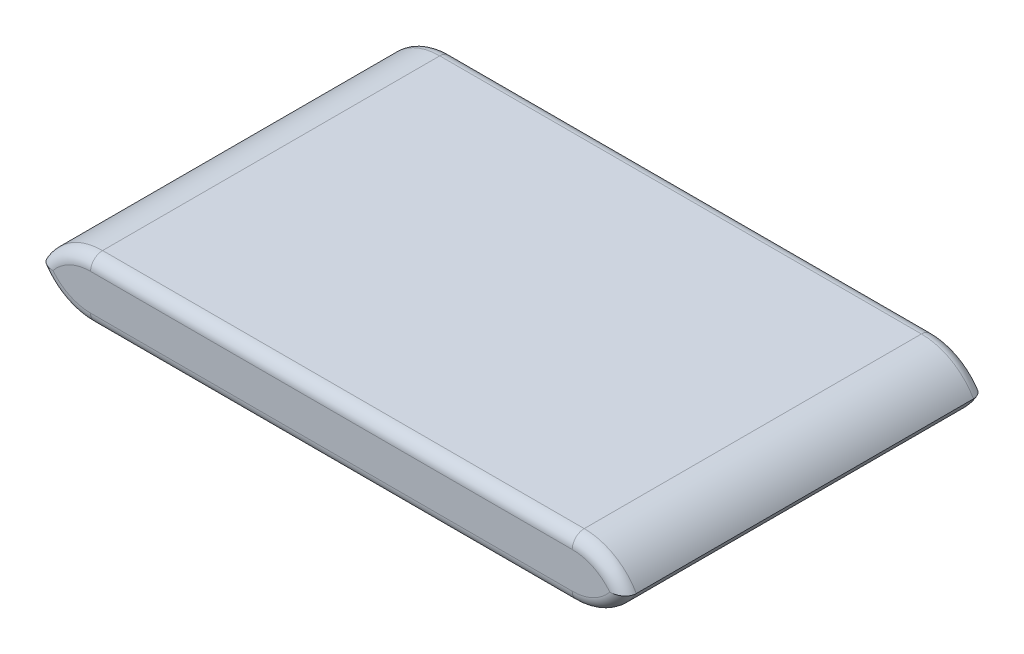
ISO-10303-21;
HEADER;
FILE_DESCRIPTION(('STEP AP214'),'2;1');
FILE_NAME('part.step','',(''),(''),'','','');
FILE_SCHEMA(('AUTOMOTIVE_DESIGN { 1 0 10303 214 1 1 1 1 }'));
ENDSEC;
DATA;
#1=APPLICATION_CONTEXT('core data for automotive mechanical design processes');
#2=APPLICATION_PROTOCOL_DEFINITION('international standard','automotive_design',2000,#1);
#3=PRODUCT_CONTEXT('',#1,'mechanical');
#4=PRODUCT('Part','Part','',(#3));
#5=PRODUCT_RELATED_PRODUCT_CATEGORY('part','',(#4));
#6=PRODUCT_DEFINITION_FORMATION('','',#4);
#7=PRODUCT_DEFINITION_CONTEXT('part definition',#1,'design');
#8=PRODUCT_DEFINITION('design','',#6,#7);
#9=PRODUCT_DEFINITION_SHAPE('','',#8);
#10=(LENGTH_UNIT() NAMED_UNIT(*) SI_UNIT(.MILLI.,.METRE.));
#11=(NAMED_UNIT(*) PLANE_ANGLE_UNIT() SI_UNIT($,.RADIAN.));
#12=(NAMED_UNIT(*) SI_UNIT($,.STERADIAN.) SOLID_ANGLE_UNIT());
#13=UNCERTAINTY_MEASURE_WITH_UNIT(LENGTH_MEASURE(1.E-05),#10,'distance_accuracy_value','');
#14=(GEOMETRIC_REPRESENTATION_CONTEXT(3) GLOBAL_UNCERTAINTY_ASSIGNED_CONTEXT((#13)) GLOBAL_UNIT_ASSIGNED_CONTEXT((#10,
#11,#12)) REPRESENTATION_CONTEXT('',''));
#15=CARTESIAN_POINT('',(0.,0.,0.));
#16=DIRECTION('',(0.,0.,1.));
#17=DIRECTION('',(1.,0.,0.));
#18=AXIS2_PLACEMENT_3D('',#15,#16,#17);
#19=CARTESIAN_POINT('',(-25.,5.,-15.));
#20=DIRECTION('',(0.,0.,1.));
#21=DIRECTION('',(1.,0.,0.));
#22=AXIS2_PLACEMENT_3D('',#19,#20,#21);
#23=PLANE('',#22);
#24=CARTESIAN_POINT('',(20.,0.,-15.));
#25=DIRECTION('',(0.,0.,1.));
#26=DIRECTION('',(1.,0.,0.));
#27=AXIS2_PLACEMENT_3D('',#24,#25,#26);
#28=CIRCLE('',#27,4.);
#29=CARTESIAN_POINT('',(20.,4.,-15.));
#30=VERTEX_POINT('',#29);
#31=CARTESIAN_POINT('',(23.1224989991992,2.5,-15.));
#32=VERTEX_POINT('',#31);
#33=EDGE_CURVE('E149',#30,#32,#28,.F.);
#34=ORIENTED_EDGE('',*,*,#33,.T.);
#35=CARTESIAN_POINT('',(20.,5.,-15.));
#36=DIRECTION('',(0.,0.,1.));
#37=DIRECTION('',(1.,0.,0.));
#38=AXIS2_PLACEMENT_3D('',#35,#36,#37);
#39=CIRCLE('',#38,4.);
#40=CARTESIAN_POINT('',(20.,1.,-15.));
#41=VERTEX_POINT('',#40);
#42=EDGE_CURVE('E131',#32,#41,#39,.F.);
#43=ORIENTED_EDGE('',*,*,#42,.T.);
#44=DIRECTION('',(-1.,0.,0.));
#45=VECTOR('',#44,1.);
#46=CARTESIAN_POINT('',(-25.,1.,-15.));
#47=LINE('',#46,#45);
#48=CARTESIAN_POINT('',(-20.,1.,-15.));
#49=VERTEX_POINT('',#48);
#50=EDGE_CURVE('E139',#41,#49,#47,.T.);
#51=ORIENTED_EDGE('',*,*,#50,.T.);
#52=CARTESIAN_POINT('',(-20.,5.,-15.));
#53=DIRECTION('',(0.,0.,1.));
#54=DIRECTION('',(1.,0.,0.));
#55=AXIS2_PLACEMENT_3D('',#52,#53,#54);
#56=CIRCLE('',#55,4.);
#57=CARTESIAN_POINT('',(-23.1224989991992,2.5,-15.));
#58=VERTEX_POINT('',#57);
#59=EDGE_CURVE('E145',#49,#58,#56,.F.);
#60=ORIENTED_EDGE('',*,*,#59,.T.);
#61=CARTESIAN_POINT('',(-20.,0.,-15.));
#62=DIRECTION('',(0.,0.,1.));
#63=DIRECTION('',(1.,0.,0.));
#64=AXIS2_PLACEMENT_3D('',#61,#62,#63);
#65=CIRCLE('',#64,4.);
#66=CARTESIAN_POINT('',(-20.,4.,-15.));
#67=VERTEX_POINT('',#66);
#68=EDGE_CURVE('E310',#58,#67,#65,.F.);
#69=ORIENTED_EDGE('',*,*,#68,.T.);
#70=DIRECTION('',(-1.,0.,0.));
#71=VECTOR('',#70,1.);
#72=CARTESIAN_POINT('',(20.,4.,-15.));
#73=LINE('',#72,#71);
#74=EDGE_CURVE('E154',#67,#30,#73,.F.);
#75=ORIENTED_EDGE('',*,*,#74,.T.);
#76=EDGE_LOOP('',(#34,#43,#51,#60,#69,#75));
#77=FACE_BOUND('',#76,.T.);
#78=ADVANCED_FACE('F37',(#77),#23,.F.);
#79=CARTESIAN_POINT('',(-25.,5.,15.));
#80=DIRECTION('',(0.,0.,-1.));
#81=DIRECTION('',(-1.,0.,0.));
#82=AXIS2_PLACEMENT_3D('',#79,#80,#81);
#83=PLANE('',#82);
#84=CARTESIAN_POINT('',(20.,0.,15.));
#85=DIRECTION('',(0.,0.,-1.));
#86=DIRECTION('',(-1.,0.,0.));
#87=AXIS2_PLACEMENT_3D('',#84,#85,#86);
#88=CIRCLE('',#87,4.);
#89=CARTESIAN_POINT('',(23.1224989991992,2.5,15.));
#90=VERTEX_POINT('',#89);
#91=CARTESIAN_POINT('',(20.,4.,15.));
#92=VERTEX_POINT('',#91);
#93=EDGE_CURVE('E46',#90,#92,#88,.F.);
#94=ORIENTED_EDGE('',*,*,#93,.T.);
#95=DIRECTION('',(1.,0.,0.));
#96=VECTOR('',#95,1.);
#97=CARTESIAN_POINT('',(-20.,4.,15.));
#98=LINE('',#97,#96);
#99=CARTESIAN_POINT('',(-20.,4.,15.));
#100=VERTEX_POINT('',#99);
#101=EDGE_CURVE('E11',#92,#100,#98,.F.);
#102=ORIENTED_EDGE('',*,*,#101,.T.);
#103=CARTESIAN_POINT('',(-20.,0.,15.));
#104=DIRECTION('',(0.,0.,-1.));
#105=DIRECTION('',(-1.,0.,0.));
#106=AXIS2_PLACEMENT_3D('',#103,#104,#105);
#107=CIRCLE('',#106,4.);
#108=CARTESIAN_POINT('',(-23.1224989991992,2.5,15.));
#109=VERTEX_POINT('',#108);
#110=EDGE_CURVE('E180',#100,#109,#107,.F.);
#111=ORIENTED_EDGE('',*,*,#110,.T.);
#112=CARTESIAN_POINT('',(-20.,5.,15.));
#113=DIRECTION('',(0.,0.,-1.));
#114=DIRECTION('',(-1.,0.,0.));
#115=AXIS2_PLACEMENT_3D('',#112,#113,#114);
#116=CIRCLE('',#115,4.);
#117=CARTESIAN_POINT('',(-20.,1.,15.));
#118=VERTEX_POINT('',#117);
#119=EDGE_CURVE('E182',#109,#118,#116,.F.);
#120=ORIENTED_EDGE('',*,*,#119,.T.);
#121=DIRECTION('',(1.,0.,0.));
#122=VECTOR('',#121,1.);
#123=CARTESIAN_POINT('',(-25.,1.,15.));
#124=LINE('',#123,#122);
#125=CARTESIAN_POINT('',(20.,1.,15.));
#126=VERTEX_POINT('',#125);
#127=EDGE_CURVE('E184',#118,#126,#124,.T.);
#128=ORIENTED_EDGE('',*,*,#127,.T.);
#129=CARTESIAN_POINT('',(20.,5.,15.));
#130=DIRECTION('',(0.,0.,-1.));
#131=DIRECTION('',(-1.,0.,0.));
#132=AXIS2_PLACEMENT_3D('',#129,#130,#131);
#133=CIRCLE('',#132,4.);
#134=EDGE_CURVE('E57',#126,#90,#133,.F.);
#135=ORIENTED_EDGE('',*,*,#134,.T.);
#136=EDGE_LOOP('',(#94,#102,#111,#120,#128,#135));
#137=FACE_BOUND('',#136,.T.);
#138=ADVANCED_FACE('F269',(#137),#83,.F.);
#139=CARTESIAN_POINT('',(0.,5.,0.));
#140=DIRECTION('',(0.,1.,0.));
#141=DIRECTION('',(0.,0.,1.));
#142=AXIS2_PLACEMENT_3D('',#139,#140,#141);
#143=PLANE('',#142);
#144=DIRECTION('',(0.,0.,-1.));
#145=VECTOR('',#144,1.);
#146=CARTESIAN_POINT('',(20.,5.,-15.));
#147=LINE('',#146,#145);
#148=CARTESIAN_POINT('',(20.,5.,14.));
#149=VERTEX_POINT('',#148);
#150=CARTESIAN_POINT('',(20.,5.,-14.));
#151=VERTEX_POINT('',#150);
#152=EDGE_CURVE('E326',#149,#151,#147,.T.);
#153=ORIENTED_EDGE('',*,*,#152,.T.);
#154=DIRECTION('',(-1.,0.,0.));
#155=VECTOR('',#154,1.);
#156=CARTESIAN_POINT('',(-20.,5.,-14.));
#157=LINE('',#156,#155);
#158=CARTESIAN_POINT('',(-20.,5.,-14.));
#159=VERTEX_POINT('',#158);
#160=EDGE_CURVE('E166',#151,#159,#157,.T.);
#161=ORIENTED_EDGE('',*,*,#160,.T.);
#162=DIRECTION('',(0.,0.,1.));
#163=VECTOR('',#162,1.);
#164=CARTESIAN_POINT('',(-20.,5.,15.));
#165=LINE('',#164,#163);
#166=CARTESIAN_POINT('',(-20.,5.,14.));
#167=VERTEX_POINT('',#166);
#168=EDGE_CURVE('E146',#159,#167,#165,.T.);
#169=ORIENTED_EDGE('',*,*,#168,.T.);
#170=DIRECTION('',(1.,0.,0.));
#171=VECTOR('',#170,1.);
#172=CARTESIAN_POINT('',(20.,5.,14.));
#173=LINE('',#172,#171);
#174=EDGE_CURVE('E163',#167,#149,#173,.T.);
#175=ORIENTED_EDGE('',*,*,#174,.T.);
#176=EDGE_LOOP('',(#153,#161,#169,#175));
#177=FACE_BOUND('',#176,.T.);
#178=ADVANCED_FACE('F274',(#177),#143,.T.);
#179=CARTESIAN_POINT('',(0.,0.,0.));
#180=DIRECTION('',(0.,1.,0.));
#181=DIRECTION('',(0.,0.,1.));
#182=AXIS2_PLACEMENT_3D('',#179,#180,#181);
#183=PLANE('',#182);
#184=DIRECTION('',(0.,0.,1.));
#185=VECTOR('',#184,1.);
#186=CARTESIAN_POINT('',(-20.,0.,0.));
#187=LINE('',#186,#185);
#188=CARTESIAN_POINT('',(-20.,0.,14.));
#189=VERTEX_POINT('',#188);
#190=CARTESIAN_POINT('',(-20.,0.,-14.));
#191=VERTEX_POINT('',#190);
#192=EDGE_CURVE('E323',#189,#191,#187,.F.);
#193=ORIENTED_EDGE('',*,*,#192,.T.);
#194=DIRECTION('',(-1.,0.,0.));
#195=VECTOR('',#194,1.);
#196=CARTESIAN_POINT('',(0.,0.,-14.));
#197=LINE('',#196,#195);
#198=CARTESIAN_POINT('',(20.,0.,-14.));
#199=VERTEX_POINT('',#198);
#200=EDGE_CURVE('E178',#191,#199,#197,.F.);
#201=ORIENTED_EDGE('',*,*,#200,.T.);
#202=DIRECTION('',(0.,0.,-1.));
#203=VECTOR('',#202,1.);
#204=CARTESIAN_POINT('',(20.,0.,0.));
#205=LINE('',#204,#203);
#206=CARTESIAN_POINT('',(20.,0.,14.));
#207=VERTEX_POINT('',#206);
#208=EDGE_CURVE('E305',#199,#207,#205,.F.);
#209=ORIENTED_EDGE('',*,*,#208,.T.);
#210=DIRECTION('',(1.,0.,0.));
#211=VECTOR('',#210,1.);
#212=CARTESIAN_POINT('',(0.,0.,14.));
#213=LINE('',#212,#211);
#214=EDGE_CURVE('E176',#207,#189,#213,.F.);
#215=ORIENTED_EDGE('',*,*,#214,.T.);
#216=EDGE_LOOP('',(#193,#201,#209,#215));
#217=FACE_BOUND('',#216,.T.);
#218=ADVANCED_FACE('F286',(#217),#183,.F.);
#219=CARTESIAN_POINT('',(-20.,0.,0.));
#220=DIRECTION('',(0.,0.,-1.));
#221=DIRECTION('',(-1.,0.,0.));
#222=AXIS2_PLACEMENT_3D('',#219,#220,#221);
#223=CYLINDRICAL_SURFACE('',#222,5.);
#224=ORIENTED_EDGE('',*,*,#168,.F.);
#225=CARTESIAN_POINT('',(-20.,0.,-14.));
#226=DIRECTION('',(0.,0.,1.));
#227=DIRECTION('',(1.,0.,0.));
#228=AXIS2_PLACEMENT_3D('',#225,#226,#227);
#229=CIRCLE('',#228,5.);
#230=CARTESIAN_POINT('',(-24.3301270189222,2.5,-14.));
#231=VERTEX_POINT('',#230);
#232=EDGE_CURVE('E170',#159,#231,#229,.T.);
#233=ORIENTED_EDGE('',*,*,#232,.T.);
#234=DIRECTION('',(0.,0.,-1.));
#235=VECTOR('',#234,1.);
#236=CARTESIAN_POINT('',(-24.3301270189222,2.5,0.));
#237=LINE('',#236,#235);
#238=CARTESIAN_POINT('',(-24.3301270189222,2.5,14.));
#239=VERTEX_POINT('',#238);
#240=EDGE_CURVE('E302',#239,#231,#237,.T.);
#241=ORIENTED_EDGE('',*,*,#240,.F.);
#242=CARTESIAN_POINT('',(-20.,0.,14.));
#243=DIRECTION('',(0.,0.,-1.));
#244=DIRECTION('',(-1.,0.,0.));
#245=AXIS2_PLACEMENT_3D('',#242,#243,#244);
#246=CIRCLE('',#245,5.);
#247=EDGE_CURVE('E168',#239,#167,#246,.T.);
#248=ORIENTED_EDGE('',*,*,#247,.T.);
#249=EDGE_LOOP('',(#224,#233,#241,#248));
#250=FACE_BOUND('',#249,.T.);
#251=ADVANCED_FACE('F282',(#250),#223,.T.);
#252=CARTESIAN_POINT('',(-20.,5.,-15.));
#253=DIRECTION('',(0.,0.,1.));
#254=DIRECTION('',(1.,0.,0.));
#255=AXIS2_PLACEMENT_3D('',#252,#253,#254);
#256=CYLINDRICAL_SURFACE('',#255,5.);
#257=ORIENTED_EDGE('',*,*,#240,.T.);
#258=CARTESIAN_POINT('',(-20.,5.,-14.));
#259=DIRECTION('',(0.,0.,1.));
#260=DIRECTION('',(1.,0.,0.));
#261=AXIS2_PLACEMENT_3D('',#258,#259,#260);
#262=CIRCLE('',#261,5.);
#263=EDGE_CURVE('E174',#231,#191,#262,.T.);
#264=ORIENTED_EDGE('',*,*,#263,.T.);
#265=ORIENTED_EDGE('',*,*,#192,.F.);
#266=CARTESIAN_POINT('',(-20.,5.,14.));
#267=DIRECTION('',(0.,0.,-1.));
#268=DIRECTION('',(-1.,0.,0.));
#269=AXIS2_PLACEMENT_3D('',#266,#267,#268);
#270=CIRCLE('',#269,5.);
#271=EDGE_CURVE('E172',#189,#239,#270,.T.);
#272=ORIENTED_EDGE('',*,*,#271,.T.);
#273=EDGE_LOOP('',(#257,#264,#265,#272));
#274=FACE_BOUND('',#273,.T.);
#275=ADVANCED_FACE('F278',(#274),#256,.T.);
#276=CARTESIAN_POINT('',(20.,0.,0.));
#277=DIRECTION('',(0.,0.,1.));
#278=DIRECTION('',(1.,0.,0.));
#279=AXIS2_PLACEMENT_3D('',#276,#277,#278);
#280=CYLINDRICAL_SURFACE('',#279,5.);
#281=DIRECTION('',(0.,0.,1.));
#282=VECTOR('',#281,1.);
#283=CARTESIAN_POINT('',(24.3301270189222,2.5,0.));
#284=LINE('',#283,#282);
#285=CARTESIAN_POINT('',(24.3301270189222,2.5,-14.));
#286=VERTEX_POINT('',#285);
#287=CARTESIAN_POINT('',(24.3301270189222,2.5,14.));
#288=VERTEX_POINT('',#287);
#289=EDGE_CURVE('E225',#286,#288,#284,.T.);
#290=ORIENTED_EDGE('',*,*,#289,.F.);
#291=CARTESIAN_POINT('',(20.,0.,-14.));
#292=DIRECTION('',(0.,0.,1.));
#293=DIRECTION('',(1.,0.,0.));
#294=AXIS2_PLACEMENT_3D('',#291,#292,#293);
#295=CIRCLE('',#294,5.);
#296=EDGE_CURVE('E161',#286,#151,#295,.T.);
#297=ORIENTED_EDGE('',*,*,#296,.T.);
#298=ORIENTED_EDGE('',*,*,#152,.F.);
#299=CARTESIAN_POINT('',(20.,0.,14.));
#300=DIRECTION('',(0.,0.,-1.));
#301=DIRECTION('',(-1.,0.,0.));
#302=AXIS2_PLACEMENT_3D('',#299,#300,#301);
#303=CIRCLE('',#302,5.);
#304=EDGE_CURVE('E159',#149,#288,#303,.T.);
#305=ORIENTED_EDGE('',*,*,#304,.T.);
#306=EDGE_LOOP('',(#290,#297,#298,#305));
#307=FACE_BOUND('',#306,.T.);
#308=ADVANCED_FACE('F281',(#307),#280,.T.);
#309=CARTESIAN_POINT('',(20.,5.,-15.));
#310=DIRECTION('',(0.,0.,-1.));
#311=DIRECTION('',(-1.,0.,0.));
#312=AXIS2_PLACEMENT_3D('',#309,#310,#311);
#313=CYLINDRICAL_SURFACE('',#312,5.);
#314=ORIENTED_EDGE('',*,*,#208,.F.);
#315=CARTESIAN_POINT('',(20.,5.,-14.));
#316=DIRECTION('',(0.,0.,1.));
#317=DIRECTION('',(1.,0.,0.));
#318=AXIS2_PLACEMENT_3D('',#315,#316,#317);
#319=CIRCLE('',#318,5.);
#320=EDGE_CURVE('E133',#199,#286,#319,.T.);
#321=ORIENTED_EDGE('',*,*,#320,.T.);
#322=ORIENTED_EDGE('',*,*,#289,.T.);
#323=CARTESIAN_POINT('',(20.,5.,14.));
#324=DIRECTION('',(0.,0.,-1.));
#325=DIRECTION('',(-1.,0.,0.));
#326=AXIS2_PLACEMENT_3D('',#323,#324,#325);
#327=CIRCLE('',#326,5.);
#328=EDGE_CURVE('E151',#288,#207,#327,.T.);
#329=ORIENTED_EDGE('',*,*,#328,.T.);
#330=EDGE_LOOP('',(#314,#321,#322,#329));
#331=FACE_BOUND('',#330,.T.);
#332=ADVANCED_FACE('F288',(#331),#313,.T.);
#333=CARTESIAN_POINT('',(-20.,0.,-14.));
#334=DIRECTION('',(0.,0.,1.));
#335=DIRECTION('',(1.,0.,0.));
#336=AXIS2_PLACEMENT_3D('',#333,#334,#335);
#337=TOROIDAL_SURFACE('',#336,4.,1.);
#338=CARTESIAN_POINT('',(-24.3301270189222,2.5,-14.));
#339=CARTESIAN_POINT('',(-24.3301283457265,2.5,-14.0252658996038));
#340=CARTESIAN_POINT('',(-24.3290205120025,2.5,-14.0505187874313));
#341=CARTESIAN_POINT('',(-24.3246112700615,2.5,-14.1008254847327));
#342=CARTESIAN_POINT('',(-24.3213104637422,2.5,-14.1258793469236));
#343=CARTESIAN_POINT('',(-24.3081952784752,2.5,-14.2002739880487));
#344=CARTESIAN_POINT('',(-24.2951676015747,2.5,-14.2490842373653));
#345=CARTESIAN_POINT('',(-24.2611375132148,2.5,-14.3437605490324));
#346=CARTESIAN_POINT('',(-24.2401398128088,2.5,-14.3896283319771));
#347=CARTESIAN_POINT('',(-24.1910441037484,2.5,-14.4774101496428));
#348=CARTESIAN_POINT('',(-24.162941664715,2.5,-14.5193216948502));
#349=CARTESIAN_POINT('',(-24.0993498457045,2.5,-14.6000597366421));
#350=CARTESIAN_POINT('',(-24.0635946035027,2.5,-14.638675832347));
#351=CARTESIAN_POINT('',(-23.9867509819995,2.5,-14.7101468579188));
#352=CARTESIAN_POINT('',(-23.9456611134371,2.5,-14.743000172953));
#353=CARTESIAN_POINT('',(-23.8540174771055,2.5,-14.8063624972071));
#354=CARTESIAN_POINT('',(-23.8029213691158,2.5,-14.8360849813042));
#355=CARTESIAN_POINT('',(-23.6969972475473,2.5,-14.8879185947517));
#356=CARTESIAN_POINT('',(-23.6421660048608,2.5,-14.9100230354969));
#357=CARTESIAN_POINT('',(-23.5207900710911,2.5,-14.9498682187721));
#358=CARTESIAN_POINT('',(-23.4538108498641,2.5,-14.966277331813));
#359=CARTESIAN_POINT('',(-23.3183151899925,2.5,-14.989567060893));
#360=CARTESIAN_POINT('',(-23.2498005620379,2.5,-14.9964583563212));
#361=CARTESIAN_POINT('',(-23.1637701321667,2.5,-14.9995729247678));
#362=CARTESIAN_POINT('',(-23.1463368425302,2.5,-14.9999194123782));
#363=CARTESIAN_POINT('',(-23.1267674018116,2.5,-14.9999958341676));
#364=CARTESIAN_POINT('',(-23.124633212028,2.5,-14.9999999971611));
#365=CARTESIAN_POINT('',(-23.1224989991992,2.5,-15.));
#366=B_SPLINE_CURVE_WITH_KNOTS('',3,(#338,#339,#340,#341,#342,#343,#344,#345,#346,#347,#348,
#349,#350,#351,#352,#353,#354,#355,#356,#357,#358,#359,#360,#361,#362,#363,#364,#365),
.UNSPECIFIED.,.F.,.F.,(4,2,2,2,2,2,2,2,2,2,2,2,2,4),(0.,0.0757480035366658,0.151475225363599,
0.302230037268103,0.452895876943819,0.603655901696259,0.760904225619514,0.918196543140565,
1.094852973484,1.27166411452324,1.47779787869769,1.68370016375175,1.73600678146163,
1.74240935622697),.UNSPECIFIED.);
#367=EDGE_CURVE('E214',#231,#58,#366,.T.);
#368=ORIENTED_EDGE('',*,*,#367,.F.);
#369=ORIENTED_EDGE('',*,*,#232,.F.);
#370=CARTESIAN_POINT('',(-20.,4.,-14.));
#371=DIRECTION('',(1.,0.,0.));
#372=DIRECTION('',(0.,0.,-1.));
#373=AXIS2_PLACEMENT_3D('',#370,#371,#372);
#374=CIRCLE('',#373,1.);
#375=EDGE_CURVE('E221',#67,#159,#374,.T.);
#376=ORIENTED_EDGE('',*,*,#375,.F.);
#377=ORIENTED_EDGE('',*,*,#68,.F.);
#378=EDGE_LOOP('',(#368,#369,#376,#377));
#379=FACE_BOUND('',#378,.T.);
#380=ADVANCED_FACE('F210',(#379),#337,.T.);
#381=CARTESIAN_POINT('',(0.,4.,-14.));
#382=DIRECTION('',(1.,0.,0.));
#383=DIRECTION('',(0.,0.,-1.));
#384=AXIS2_PLACEMENT_3D('',#381,#382,#383);
#385=CYLINDRICAL_SURFACE('',#384,1.);
#386=ORIENTED_EDGE('',*,*,#375,.T.);
#387=ORIENTED_EDGE('',*,*,#160,.F.);
#388=CARTESIAN_POINT('',(20.,4.,-14.));
#389=DIRECTION('',(1.,0.,0.));
#390=DIRECTION('',(0.,0.,-1.));
#391=AXIS2_PLACEMENT_3D('',#388,#389,#390);
#392=CIRCLE('',#391,1.);
#393=EDGE_CURVE('E222',#30,#151,#392,.T.);
#394=ORIENTED_EDGE('',*,*,#393,.F.);
#395=ORIENTED_EDGE('',*,*,#74,.F.);
#396=EDGE_LOOP('',(#386,#387,#394,#395));
#397=FACE_BOUND('',#396,.T.);
#398=ADVANCED_FACE('F208',(#397),#385,.T.);
#399=CARTESIAN_POINT('',(-20.,5.,-14.));
#400=DIRECTION('',(0.,0.,1.));
#401=DIRECTION('',(1.,0.,0.));
#402=AXIS2_PLACEMENT_3D('',#399,#400,#401);
#403=TOROIDAL_SURFACE('',#402,4.,1.);
#404=ORIENTED_EDGE('',*,*,#367,.T.);
#405=ORIENTED_EDGE('',*,*,#59,.F.);
#406=CARTESIAN_POINT('',(-20.,1.,-14.));
#407=DIRECTION('',(1.,0.,0.));
#408=DIRECTION('',(0.,0.,-1.));
#409=AXIS2_PLACEMENT_3D('',#406,#407,#408);
#410=CIRCLE('',#409,1.);
#411=EDGE_CURVE('E142',#191,#49,#410,.T.);
#412=ORIENTED_EDGE('',*,*,#411,.F.);
#413=ORIENTED_EDGE('',*,*,#263,.F.);
#414=EDGE_LOOP('',(#404,#405,#412,#413));
#415=FACE_BOUND('',#414,.T.);
#416=ADVANCED_FACE('F204',(#415),#403,.T.);
#417=CARTESIAN_POINT('',(20.,0.,-14.));
#418=DIRECTION('',(0.,0.,1.));
#419=DIRECTION('',(1.,0.,0.));
#420=AXIS2_PLACEMENT_3D('',#417,#418,#419);
#421=TOROIDAL_SURFACE('',#420,4.,1.);
#422=ORIENTED_EDGE('',*,*,#393,.T.);
#423=ORIENTED_EDGE('',*,*,#296,.F.);
#424=CARTESIAN_POINT('',(24.3301270189222,2.5,-14.));
#425=CARTESIAN_POINT('',(24.3301283457265,2.5,-14.0252658996038));
#426=CARTESIAN_POINT('',(24.3290205120025,2.5,-14.0505187874313));
#427=CARTESIAN_POINT('',(24.3246112700615,2.5,-14.1008254847327));
#428=CARTESIAN_POINT('',(24.3213104637422,2.5,-14.1258793469236));
#429=CARTESIAN_POINT('',(24.3081952784752,2.5,-14.2002739880487));
#430=CARTESIAN_POINT('',(24.2951676015748,2.5,-14.2490842373653));
#431=CARTESIAN_POINT('',(24.2611375132148,2.5,-14.3437605490324));
#432=CARTESIAN_POINT('',(24.2401398128088,2.5,-14.3896283319771));
#433=CARTESIAN_POINT('',(24.1910441037484,2.5,-14.4774101496428));
#434=CARTESIAN_POINT('',(24.162941664715,2.5,-14.5193216948502));
#435=CARTESIAN_POINT('',(24.0993498457046,2.5,-14.6000597366421));
#436=CARTESIAN_POINT('',(24.0635946035027,2.5,-14.638675832347));
#437=CARTESIAN_POINT('',(23.9867509819995,2.5,-14.7101468579188));
#438=CARTESIAN_POINT('',(23.9456611134371,2.5,-14.743000172953));
#439=CARTESIAN_POINT('',(23.8540174771055,2.5,-14.8063624972071));
#440=CARTESIAN_POINT('',(23.8029213691158,2.5,-14.8360849813042));
#441=CARTESIAN_POINT('',(23.6969972475473,2.5,-14.8879185947517));
#442=CARTESIAN_POINT('',(23.6421660048609,2.5,-14.9100230354969));
#443=CARTESIAN_POINT('',(23.5207900710911,2.5,-14.9498682187721));
#444=CARTESIAN_POINT('',(23.4538108498641,2.5,-14.966277331813));
#445=CARTESIAN_POINT('',(23.3183151899925,2.5,-14.989567060893));
#446=CARTESIAN_POINT('',(23.2498005620379,2.5,-14.9964583563212));
#447=CARTESIAN_POINT('',(23.1637701321667,2.5,-14.9995729247678));
#448=CARTESIAN_POINT('',(23.1463368425302,2.5,-14.9999194123782));
#449=CARTESIAN_POINT('',(23.1267674018116,2.5,-14.9999958341676));
#450=CARTESIAN_POINT('',(23.124633212028,2.5,-14.9999999971611));
#451=CARTESIAN_POINT('',(23.1224989991992,2.5,-15.));
#452=B_SPLINE_CURVE_WITH_KNOTS('',3,(#424,#425,#426,#427,#428,#429,#430,#431,#432,#433,#434,
#435,#436,#437,#438,#439,#440,#441,#442,#443,#444,#445,#446,#447,#448,#449,#450,#451),
.UNSPECIFIED.,.F.,.F.,(4,2,2,2,2,2,2,2,2,2,2,2,2,4),(0.,0.0757480035366658,0.151475225363599,
0.302230037268103,0.452895876943819,0.603655901696259,0.760904225619514,0.918196543140565,
1.094852973484,1.27166411452324,1.4777978786977,1.68370016375175,1.73600678146163,
1.74240935622697),.UNSPECIFIED.);
#453=EDGE_CURVE('E136',#32,#286,#452,.F.);
#454=ORIENTED_EDGE('',*,*,#453,.F.);
#455=ORIENTED_EDGE('',*,*,#33,.F.);
#456=EDGE_LOOP('',(#422,#423,#454,#455));
#457=FACE_BOUND('',#456,.T.);
#458=ADVANCED_FACE('F196',(#457),#421,.T.);
#459=CARTESIAN_POINT('',(-25.,1.,-14.));
#460=DIRECTION('',(-1.,0.,0.));
#461=DIRECTION('',(0.,0.,1.));
#462=AXIS2_PLACEMENT_3D('',#459,#460,#461);
#463=CYLINDRICAL_SURFACE('',#462,1.);
#464=ORIENTED_EDGE('',*,*,#411,.T.);
#465=ORIENTED_EDGE('',*,*,#50,.F.);
#466=CARTESIAN_POINT('',(20.,1.,-14.));
#467=DIRECTION('',(1.,0.,0.));
#468=DIRECTION('',(0.,0.,-1.));
#469=AXIS2_PLACEMENT_3D('',#466,#467,#468);
#470=CIRCLE('',#469,1.);
#471=EDGE_CURVE('E127',#199,#41,#470,.T.);
#472=ORIENTED_EDGE('',*,*,#471,.F.);
#473=ORIENTED_EDGE('',*,*,#200,.F.);
#474=EDGE_LOOP('',(#464,#465,#472,#473));
#475=FACE_BOUND('',#474,.T.);
#476=ADVANCED_FACE('F140',(#475),#463,.T.);
#477=CARTESIAN_POINT('',(20.,5.,-14.));
#478=DIRECTION('',(0.,0.,1.));
#479=DIRECTION('',(1.,0.,0.));
#480=AXIS2_PLACEMENT_3D('',#477,#478,#479);
#481=TOROIDAL_SURFACE('',#480,4.,1.);
#482=ORIENTED_EDGE('',*,*,#453,.T.);
#483=ORIENTED_EDGE('',*,*,#320,.F.);
#484=ORIENTED_EDGE('',*,*,#471,.T.);
#485=ORIENTED_EDGE('',*,*,#42,.F.);
#486=EDGE_LOOP('',(#482,#483,#484,#485));
#487=FACE_BOUND('',#486,.T.);
#488=ADVANCED_FACE('F129',(#487),#481,.T.);
#489=CARTESIAN_POINT('',(-25.,1.,14.));
#490=DIRECTION('',(1.,0.,0.));
#491=DIRECTION('',(0.,0.,-1.));
#492=AXIS2_PLACEMENT_3D('',#489,#490,#491);
#493=CYLINDRICAL_SURFACE('',#492,1.);
#494=CARTESIAN_POINT('',(20.,1.,14.));
#495=DIRECTION('',(1.,0.,0.));
#496=DIRECTION('',(0.,0.,-1.));
#497=AXIS2_PLACEMENT_3D('',#494,#495,#496);
#498=CIRCLE('',#497,1.);
#499=EDGE_CURVE('E342',#126,#207,#498,.T.);
#500=ORIENTED_EDGE('',*,*,#499,.F.);
#501=ORIENTED_EDGE('',*,*,#127,.F.);
#502=CARTESIAN_POINT('',(-20.,1.,14.));
#503=DIRECTION('',(-1.,0.,0.));
#504=DIRECTION('',(0.,0.,1.));
#505=AXIS2_PLACEMENT_3D('',#502,#503,#504);
#506=CIRCLE('',#505,1.);
#507=EDGE_CURVE('E41',#189,#118,#506,.T.);
#508=ORIENTED_EDGE('',*,*,#507,.F.);
#509=ORIENTED_EDGE('',*,*,#214,.F.);
#510=EDGE_LOOP('',(#500,#501,#508,#509));
#511=FACE_BOUND('',#510,.T.);
#512=ADVANCED_FACE('F39',(#511),#493,.T.);
#513=CARTESIAN_POINT('',(-20.,5.,14.));
#514=DIRECTION('',(0.,0.,-1.));
#515=DIRECTION('',(-1.,0.,0.));
#516=AXIS2_PLACEMENT_3D('',#513,#514,#515);
#517=TOROIDAL_SURFACE('',#516,4.,1.);
#518=ORIENTED_EDGE('',*,*,#507,.T.);
#519=ORIENTED_EDGE('',*,*,#119,.F.);
#520=CARTESIAN_POINT('',(-24.3301270189222,2.5,14.));
#521=CARTESIAN_POINT('',(-24.3301283457265,2.5,14.0252658996038));
#522=CARTESIAN_POINT('',(-24.3290205120025,2.5,14.0505187874313));
#523=CARTESIAN_POINT('',(-24.3246112700615,2.5,14.1008254847327));
#524=CARTESIAN_POINT('',(-24.3213104637422,2.5,14.1258793469236));
#525=CARTESIAN_POINT('',(-24.3081952784751,2.5,14.2002739880487));
#526=CARTESIAN_POINT('',(-24.2951676015747,2.5,14.2490842373653));
#527=CARTESIAN_POINT('',(-24.2611375132148,2.5,14.3437605490324));
#528=CARTESIAN_POINT('',(-24.2401398128087,2.5,14.3896283319771));
#529=CARTESIAN_POINT('',(-24.1910441037484,2.5,14.4774101496428));
#530=CARTESIAN_POINT('',(-24.162941664715,2.5,14.5193216948502));
#531=CARTESIAN_POINT('',(-24.0993498457045,2.5,14.6000597366421));
#532=CARTESIAN_POINT('',(-24.0635946035027,2.5,14.638675832347));
#533=CARTESIAN_POINT('',(-23.9867509819995,2.5,14.7101468579188));
#534=CARTESIAN_POINT('',(-23.9456611134371,2.5,14.743000172953));
#535=CARTESIAN_POINT('',(-23.8540174771055,2.50000000000001,14.8063624972071));
#536=CARTESIAN_POINT('',(-23.8029213691158,2.50000000000002,14.8360849813042));
#537=CARTESIAN_POINT('',(-23.6969972475473,2.49999999999998,14.8879185947517));
#538=CARTESIAN_POINT('',(-23.6421660048608,2.49999999999992,14.9100230354969));
#539=CARTESIAN_POINT('',(-23.5207900710911,2.5000000000001,14.9498682187721));
#540=CARTESIAN_POINT('',(-23.4538108498641,2.5000000000004,14.966277331813));
#541=CARTESIAN_POINT('',(-23.3183151899925,2.49999999999961,14.989567060893));
#542=CARTESIAN_POINT('',(-23.2498005620379,2.49999999999853,14.9964583563212));
#543=CARTESIAN_POINT('',(-23.1637701321667,2.50000000000041,14.9995729247678));
#544=CARTESIAN_POINT('',(-23.1463368425302,2.50000000000096,14.9999194123782));
#545=CARTESIAN_POINT('',(-23.1267674018116,2.50000000000022,14.9999958341676));
#546=CARTESIAN_POINT('',(-23.124633212028,2.50000000000012,14.9999999971611));
#547=CARTESIAN_POINT('',(-23.1224989991992,2.5,15.));
#548=B_SPLINE_CURVE_WITH_KNOTS('',3,(#520,#521,#522,#523,#524,#525,#526,#527,#528,#529,#530,
#531,#532,#533,#534,#535,#536,#537,#538,#539,#540,#541,#542,#543,#544,#545,#546,#547),
.UNSPECIFIED.,.F.,.F.,(4,2,2,2,2,2,2,2,2,2,2,2,2,4),(0.,0.0757480035366658,0.151475225363599,
0.302230037268103,0.452895876943822,0.603655901696261,0.760904225619514,0.918196543140566,
1.09485297348399,1.27166411452324,1.4777978786977,1.68370016375175,1.73600678146163,
1.74240935622697),.UNSPECIFIED.);
#549=EDGE_CURVE('E239',#239,#109,#548,.T.);
#550=ORIENTED_EDGE('',*,*,#549,.F.);
#551=ORIENTED_EDGE('',*,*,#271,.F.);
#552=EDGE_LOOP('',(#518,#519,#550,#551));
#553=FACE_BOUND('',#552,.T.);
#554=ADVANCED_FACE('F257',(#553),#517,.T.);
#555=CARTESIAN_POINT('',(20.,5.,14.));
#556=DIRECTION('',(0.,0.,-1.));
#557=DIRECTION('',(-1.,0.,0.));
#558=AXIS2_PLACEMENT_3D('',#555,#556,#557);
#559=TOROIDAL_SURFACE('',#558,4.,1.);
#560=ORIENTED_EDGE('',*,*,#499,.T.);
#561=ORIENTED_EDGE('',*,*,#328,.F.);
#562=CARTESIAN_POINT('',(24.3301270189222,2.5,14.));
#563=CARTESIAN_POINT('',(24.3301283457265,2.5,14.0252658996038));
#564=CARTESIAN_POINT('',(24.3290205120025,2.5,14.0505187874313));
#565=CARTESIAN_POINT('',(24.3246112700615,2.5,14.1008254847327));
#566=CARTESIAN_POINT('',(24.3213104637422,2.5,14.1258793469236));
#567=CARTESIAN_POINT('',(24.3081952784752,2.5,14.2002739880487));
#568=CARTESIAN_POINT('',(24.2951676015748,2.5,14.2490842373653));
#569=CARTESIAN_POINT('',(24.2611375132148,2.5,14.3437605490324));
#570=CARTESIAN_POINT('',(24.2401398128088,2.5,14.3896283319771));
#571=CARTESIAN_POINT('',(24.1910441037484,2.5,14.4774101496428));
#572=CARTESIAN_POINT('',(24.162941664715,2.5,14.5193216948502));
#573=CARTESIAN_POINT('',(24.0993498457046,2.5,14.6000597366421));
#574=CARTESIAN_POINT('',(24.0635946035027,2.5,14.638675832347));
#575=CARTESIAN_POINT('',(23.9867509819995,2.5,14.7101468579188));
#576=CARTESIAN_POINT('',(23.9456611134371,2.5,14.743000172953));
#577=CARTESIAN_POINT('',(23.8540174771055,2.5,14.8063624972071));
#578=CARTESIAN_POINT('',(23.8029213691158,2.5,14.8360849813042));
#579=CARTESIAN_POINT('',(23.6969972475473,2.5,14.8879185947517));
#580=CARTESIAN_POINT('',(23.6421660048609,2.5,14.9100230354969));
#581=CARTESIAN_POINT('',(23.5207900710911,2.5,14.9498682187721));
#582=CARTESIAN_POINT('',(23.4538108498641,2.5,14.966277331813));
#583=CARTESIAN_POINT('',(23.3183151899925,2.5,14.989567060893));
#584=CARTESIAN_POINT('',(23.2498005620379,2.5,14.9964583563212));
#585=CARTESIAN_POINT('',(23.1637701321667,2.5,14.9995729247678));
#586=CARTESIAN_POINT('',(23.1463368425302,2.5,14.9999194123782));
#587=CARTESIAN_POINT('',(23.1267674018116,2.5,14.9999958341676));
#588=CARTESIAN_POINT('',(23.124633212028,2.5,14.9999999971611));
#589=CARTESIAN_POINT('',(23.1224989991992,2.5,15.));
#590=B_SPLINE_CURVE_WITH_KNOTS('',3,(#562,#563,#564,#565,#566,#567,#568,#569,#570,#571,#572,
#573,#574,#575,#576,#577,#578,#579,#580,#581,#582,#583,#584,#585,#586,#587,#588,#589),
.UNSPECIFIED.,.F.,.F.,(4,2,2,2,2,2,2,2,2,2,2,2,2,4),(0.,0.0757480035366658,0.151475225363599,
0.302230037268103,0.452895876943819,0.603655901696259,0.760904225619514,0.918196543140565,
1.094852973484,1.27166411452324,1.4777978786977,1.68370016375175,1.73600678146163,
1.74240935622697),.UNSPECIFIED.);
#591=EDGE_CURVE('E230',#90,#288,#590,.F.);
#592=ORIENTED_EDGE('',*,*,#591,.F.);
#593=ORIENTED_EDGE('',*,*,#134,.F.);
#594=EDGE_LOOP('',(#560,#561,#592,#593));
#595=FACE_BOUND('',#594,.T.);
#596=ADVANCED_FACE('F245',(#595),#559,.T.);
#597=CARTESIAN_POINT('',(-20.,0.,14.));
#598=DIRECTION('',(0.,0.,-1.));
#599=DIRECTION('',(-1.,0.,0.));
#600=AXIS2_PLACEMENT_3D('',#597,#598,#599);
#601=TOROIDAL_SURFACE('',#600,4.,1.);
#602=ORIENTED_EDGE('',*,*,#549,.T.);
#603=ORIENTED_EDGE('',*,*,#110,.F.);
#604=CARTESIAN_POINT('',(-20.,4.,14.));
#605=DIRECTION('',(1.,0.,0.));
#606=DIRECTION('',(0.,0.,-1.));
#607=AXIS2_PLACEMENT_3D('',#604,#605,#606);
#608=CIRCLE('',#607,1.);
#609=EDGE_CURVE('E228',#167,#100,#608,.T.);
#610=ORIENTED_EDGE('',*,*,#609,.F.);
#611=ORIENTED_EDGE('',*,*,#247,.F.);
#612=EDGE_LOOP('',(#602,#603,#610,#611));
#613=FACE_BOUND('',#612,.T.);
#614=ADVANCED_FACE('F252',(#613),#601,.T.);
#615=CARTESIAN_POINT('',(20.,0.,14.));
#616=DIRECTION('',(0.,0.,-1.));
#617=DIRECTION('',(-1.,0.,0.));
#618=AXIS2_PLACEMENT_3D('',#615,#616,#617);
#619=TOROIDAL_SURFACE('',#618,4.,1.);
#620=ORIENTED_EDGE('',*,*,#591,.T.);
#621=ORIENTED_EDGE('',*,*,#304,.F.);
#622=CARTESIAN_POINT('',(20.,4.,14.));
#623=DIRECTION('',(-1.,0.,0.));
#624=DIRECTION('',(0.,0.,1.));
#625=AXIS2_PLACEMENT_3D('',#622,#623,#624);
#626=CIRCLE('',#625,1.);
#627=EDGE_CURVE('E226',#92,#149,#626,.T.);
#628=ORIENTED_EDGE('',*,*,#627,.F.);
#629=ORIENTED_EDGE('',*,*,#93,.F.);
#630=EDGE_LOOP('',(#620,#621,#628,#629));
#631=FACE_BOUND('',#630,.T.);
#632=ADVANCED_FACE('F248',(#631),#619,.T.);
#633=CARTESIAN_POINT('',(0.,4.,14.));
#634=DIRECTION('',(-1.,0.,0.));
#635=DIRECTION('',(0.,0.,1.));
#636=AXIS2_PLACEMENT_3D('',#633,#634,#635);
#637=CYLINDRICAL_SURFACE('',#636,1.);
#638=ORIENTED_EDGE('',*,*,#609,.T.);
#639=ORIENTED_EDGE('',*,*,#101,.F.);
#640=ORIENTED_EDGE('',*,*,#627,.T.);
#641=ORIENTED_EDGE('',*,*,#174,.F.);
#642=EDGE_LOOP('',(#638,#639,#640,#641));
#643=FACE_BOUND('',#642,.T.);
#644=ADVANCED_FACE('F251',(#643),#637,.T.);
#645=CLOSED_SHELL('',(#78,#138,#178,#218,#251,#275,#308,#332,#380,#398,#416,#458,#476,#488,#512,
#554,#596,#614,#632,#644));
#646=MANIFOLD_SOLID_BREP('B2',#645);
#647=ADVANCED_BREP_SHAPE_REPRESENTATION('',(#18,#646),#14);
#648=SHAPE_DEFINITION_REPRESENTATION(#9,#647);
ENDSEC;
END-ISO-10303-21;
